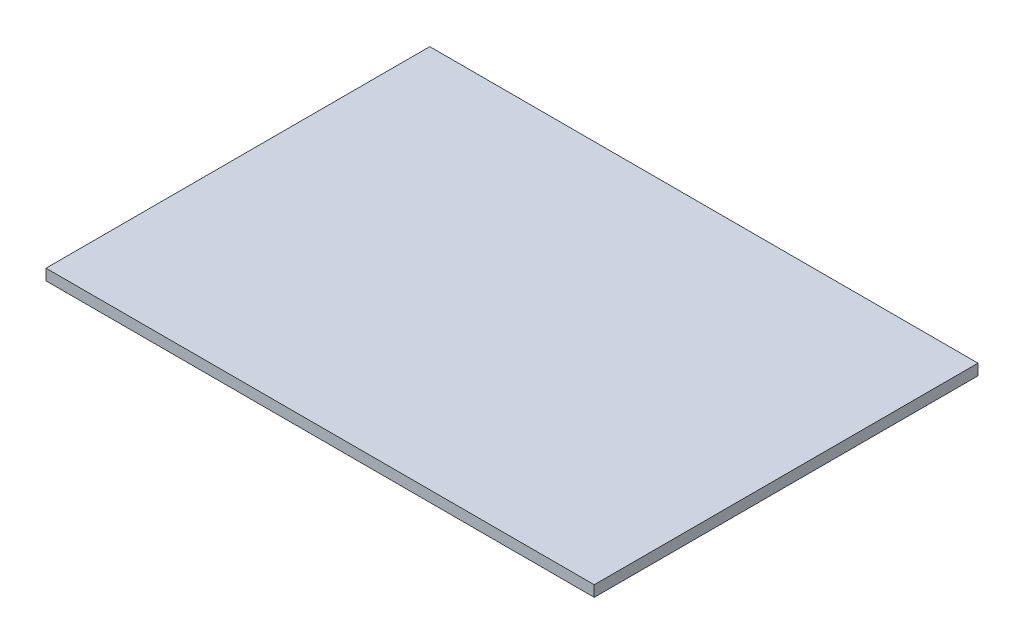
ISO-10303-21;
HEADER;
FILE_DESCRIPTION(('STEP AP214'),'2;1');
FILE_NAME('part.step','',(''),(''),'','','');
FILE_SCHEMA(('AUTOMOTIVE_DESIGN { 1 0 10303 214 1 1 1 1 }'));
ENDSEC;
DATA;
#1=APPLICATION_CONTEXT('core data for automotive mechanical design processes');
#2=APPLICATION_PROTOCOL_DEFINITION('international standard','automotive_design',2000,#1);
#3=PRODUCT_CONTEXT('',#1,'mechanical');
#4=PRODUCT('Part','Part','',(#3));
#5=PRODUCT_RELATED_PRODUCT_CATEGORY('part','',(#4));
#6=PRODUCT_DEFINITION_FORMATION('','',#4);
#7=PRODUCT_DEFINITION_CONTEXT('part definition',#1,'design');
#8=PRODUCT_DEFINITION('design','',#6,#7);
#9=PRODUCT_DEFINITION_SHAPE('','',#8);
#10=(LENGTH_UNIT() NAMED_UNIT(*) SI_UNIT(.MILLI.,.METRE.));
#11=(NAMED_UNIT(*) PLANE_ANGLE_UNIT() SI_UNIT($,.RADIAN.));
#12=(NAMED_UNIT(*) SI_UNIT($,.STERADIAN.) SOLID_ANGLE_UNIT());
#13=UNCERTAINTY_MEASURE_WITH_UNIT(LENGTH_MEASURE(1.E-05),#10,'distance_accuracy_value','');
#14=(GEOMETRIC_REPRESENTATION_CONTEXT(3) GLOBAL_UNCERTAINTY_ASSIGNED_CONTEXT((#13)) GLOBAL_UNIT_ASSIGNED_CONTEXT((#10,
#11,#12)) REPRESENTATION_CONTEXT('',''));
#15=CARTESIAN_POINT('',(0.,0.,0.));
#16=DIRECTION('',(0.,0.,1.));
#17=DIRECTION('',(1.,0.,0.));
#18=AXIS2_PLACEMENT_3D('',#15,#16,#17);
#19=CARTESIAN_POINT('',(50.,2.,35.));
#20=DIRECTION('',(-1.,0.,0.));
#21=DIRECTION('',(0.,0.,1.));
#22=AXIS2_PLACEMENT_3D('',#19,#20,#21);
#23=PLANE('',#22);
#24=DIRECTION('',(0.,0.,-1.));
#25=VECTOR('',#24,1.);
#26=CARTESIAN_POINT('',(50.,0.,35.));
#27=LINE('',#26,#25);
#28=CARTESIAN_POINT('',(50.,0.,35.));
#29=VERTEX_POINT('',#28);
#30=CARTESIAN_POINT('',(50.,0.,-35.));
#31=VERTEX_POINT('',#30);
#32=EDGE_CURVE('E105',#29,#31,#27,.T.);
#33=ORIENTED_EDGE('',*,*,#32,.T.);
#34=DIRECTION('',(0.,-1.,0.));
#35=VECTOR('',#34,1.);
#36=CARTESIAN_POINT('',(50.,2.,-35.));
#37=LINE('',#36,#35);
#38=CARTESIAN_POINT('',(50.,2.,-35.));
#39=VERTEX_POINT('',#38);
#40=EDGE_CURVE('E11',#39,#31,#37,.T.);
#41=ORIENTED_EDGE('',*,*,#40,.F.);
#42=DIRECTION('',(0.,0.,-1.));
#43=VECTOR('',#42,1.);
#44=CARTESIAN_POINT('',(50.,2.,35.));
#45=LINE('',#44,#43);
#46=CARTESIAN_POINT('',(50.,2.,35.));
#47=VERTEX_POINT('',#46);
#48=EDGE_CURVE('E93',#47,#39,#45,.T.);
#49=ORIENTED_EDGE('',*,*,#48,.F.);
#50=DIRECTION('',(0.,-1.,0.));
#51=VECTOR('',#50,1.);
#52=CARTESIAN_POINT('',(50.,2.,35.));
#53=LINE('',#52,#51);
#54=EDGE_CURVE('E101',#47,#29,#53,.T.);
#55=ORIENTED_EDGE('',*,*,#54,.T.);
#56=EDGE_LOOP('',(#33,#41,#49,#55));
#57=FACE_BOUND('',#56,.T.);
#58=ADVANCED_FACE('F42',(#57),#23,.F.);
#59=CARTESIAN_POINT('',(-50.,2.,-35.));
#60=DIRECTION('',(0.,0.,1.));
#61=DIRECTION('',(1.,0.,0.));
#62=AXIS2_PLACEMENT_3D('',#59,#60,#61);
#63=PLANE('',#62);
#64=DIRECTION('',(-1.,0.,0.));
#65=VECTOR('',#64,1.);
#66=CARTESIAN_POINT('',(-50.,0.,-35.));
#67=LINE('',#66,#65);
#68=CARTESIAN_POINT('',(-50.,0.,-35.));
#69=VERTEX_POINT('',#68);
#70=EDGE_CURVE('E97',#31,#69,#67,.T.);
#71=ORIENTED_EDGE('',*,*,#70,.T.);
#72=DIRECTION('',(0.,-1.,0.));
#73=VECTOR('',#72,1.);
#74=CARTESIAN_POINT('',(-50.,2.,-35.));
#75=LINE('',#74,#73);
#76=CARTESIAN_POINT('',(-50.,2.,-35.));
#77=VERTEX_POINT('',#76);
#78=EDGE_CURVE('E50',#77,#69,#75,.T.);
#79=ORIENTED_EDGE('',*,*,#78,.F.);
#80=DIRECTION('',(-1.,0.,0.));
#81=VECTOR('',#80,1.);
#82=CARTESIAN_POINT('',(-50.,2.,-35.));
#83=LINE('',#82,#81);
#84=EDGE_CURVE('E88',#39,#77,#83,.T.);
#85=ORIENTED_EDGE('',*,*,#84,.F.);
#86=ORIENTED_EDGE('',*,*,#40,.T.);
#87=EDGE_LOOP('',(#71,#79,#85,#86));
#88=FACE_BOUND('',#87,.T.);
#89=ADVANCED_FACE('F96',(#88),#63,.F.);
#90=CARTESIAN_POINT('',(-50.,2.,35.));
#91=DIRECTION('',(1.,0.,0.));
#92=DIRECTION('',(0.,0.,-1.));
#93=AXIS2_PLACEMENT_3D('',#90,#91,#92);
#94=PLANE('',#93);
#95=DIRECTION('',(0.,0.,1.));
#96=VECTOR('',#95,1.);
#97=CARTESIAN_POINT('',(-50.,0.,35.));
#98=LINE('',#97,#96);
#99=CARTESIAN_POINT('',(-50.,0.,35.));
#100=VERTEX_POINT('',#99);
#101=EDGE_CURVE('E75',#69,#100,#98,.T.);
#102=ORIENTED_EDGE('',*,*,#101,.T.);
#103=DIRECTION('',(0.,-1.,0.));
#104=VECTOR('',#103,1.);
#105=CARTESIAN_POINT('',(-50.,2.,35.));
#106=LINE('',#105,#104);
#107=CARTESIAN_POINT('',(-50.,2.,35.));
#108=VERTEX_POINT('',#107);
#109=EDGE_CURVE('E98',#108,#100,#106,.T.);
#110=ORIENTED_EDGE('',*,*,#109,.F.);
#111=DIRECTION('',(0.,0.,1.));
#112=VECTOR('',#111,1.);
#113=CARTESIAN_POINT('',(-50.,2.,35.));
#114=LINE('',#113,#112);
#115=EDGE_CURVE('E91',#77,#108,#114,.T.);
#116=ORIENTED_EDGE('',*,*,#115,.F.);
#117=ORIENTED_EDGE('',*,*,#78,.T.);
#118=EDGE_LOOP('',(#102,#110,#116,#117));
#119=FACE_BOUND('',#118,.T.);
#120=ADVANCED_FACE('F99',(#119),#94,.F.);
#121=CARTESIAN_POINT('',(-50.,2.,35.));
#122=DIRECTION('',(0.,0.,-1.));
#123=DIRECTION('',(-1.,0.,0.));
#124=AXIS2_PLACEMENT_3D('',#121,#122,#123);
#125=PLANE('',#124);
#126=DIRECTION('',(1.,0.,0.));
#127=VECTOR('',#126,1.);
#128=CARTESIAN_POINT('',(-50.,0.,35.));
#129=LINE('',#128,#127);
#130=EDGE_CURVE('E81',#100,#29,#129,.T.);
#131=ORIENTED_EDGE('',*,*,#130,.T.);
#132=ORIENTED_EDGE('',*,*,#54,.F.);
#133=DIRECTION('',(1.,0.,0.));
#134=VECTOR('',#133,1.);
#135=CARTESIAN_POINT('',(-50.,2.,35.));
#136=LINE('',#135,#134);
#137=EDGE_CURVE('E58',#108,#47,#136,.T.);
#138=ORIENTED_EDGE('',*,*,#137,.F.);
#139=ORIENTED_EDGE('',*,*,#109,.T.);
#140=EDGE_LOOP('',(#131,#132,#138,#139));
#141=FACE_BOUND('',#140,.T.);
#142=ADVANCED_FACE('F112',(#141),#125,.F.);
#143=CARTESIAN_POINT('',(0.,2.,0.));
#144=DIRECTION('',(0.,-1.,0.));
#145=DIRECTION('',(0.,0.,-1.));
#146=AXIS2_PLACEMENT_3D('',#143,#144,#145);
#147=PLANE('',#146);
#148=ORIENTED_EDGE('',*,*,#48,.T.);
#149=ORIENTED_EDGE('',*,*,#84,.T.);
#150=ORIENTED_EDGE('',*,*,#115,.T.);
#151=ORIENTED_EDGE('',*,*,#137,.T.);
#152=EDGE_LOOP('',(#148,#149,#150,#151));
#153=FACE_BOUND('',#152,.T.);
#154=ADVANCED_FACE('F89',(#153),#147,.F.);
#155=CARTESIAN_POINT('',(0.,0.,0.));
#156=DIRECTION('',(0.,-1.,0.));
#157=DIRECTION('',(0.,0.,-1.));
#158=AXIS2_PLACEMENT_3D('',#155,#156,#157);
#159=PLANE('',#158);
#160=ORIENTED_EDGE('',*,*,#32,.F.);
#161=ORIENTED_EDGE('',*,*,#130,.F.);
#162=ORIENTED_EDGE('',*,*,#101,.F.);
#163=ORIENTED_EDGE('',*,*,#70,.F.);
#164=EDGE_LOOP('',(#160,#161,#162,#163));
#165=FACE_BOUND('',#164,.T.);
#166=ADVANCED_FACE('F115',(#165),#159,.T.);
#167=CLOSED_SHELL('',(#58,#89,#120,#142,#154,#166));
#168=MANIFOLD_SOLID_BREP('B2',#167);
#169=ADVANCED_BREP_SHAPE_REPRESENTATION('',(#18,#168),#14);
#170=SHAPE_DEFINITION_REPRESENTATION(#9,#169);
ENDSEC;
END-ISO-10303-21;
